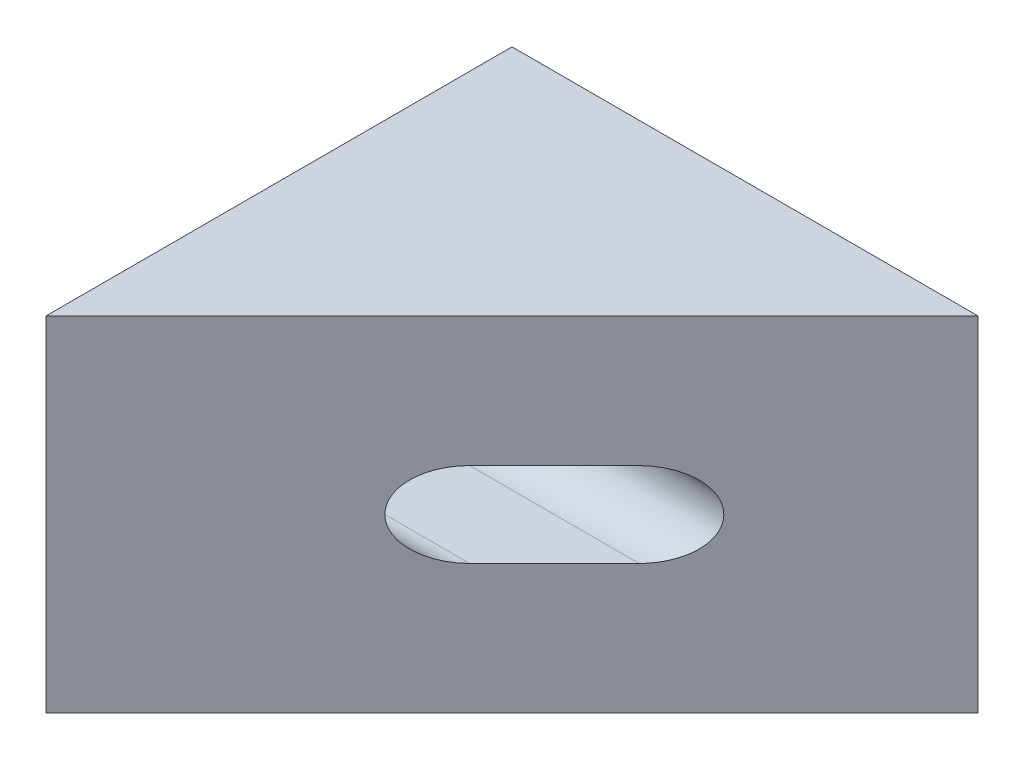
ISO-10303-21;
HEADER;
FILE_DESCRIPTION(('STEP AP214'),'2;1');
FILE_NAME('part.step','',(''),(''),'','','');
FILE_SCHEMA(('AUTOMOTIVE_DESIGN { 1 0 10303 214 1 1 1 1 }'));
ENDSEC;
DATA;
#1=APPLICATION_CONTEXT('core data for automotive mechanical design processes');
#2=APPLICATION_PROTOCOL_DEFINITION('international standard','automotive_design',2000,#1);
#3=PRODUCT_CONTEXT('',#1,'mechanical');
#4=PRODUCT('Part','Part','',(#3));
#5=PRODUCT_RELATED_PRODUCT_CATEGORY('part','',(#4));
#6=PRODUCT_DEFINITION_FORMATION('','',#4);
#7=PRODUCT_DEFINITION_CONTEXT('part definition',#1,'design');
#8=PRODUCT_DEFINITION('design','',#6,#7);
#9=PRODUCT_DEFINITION_SHAPE('','',#8);
#10=(LENGTH_UNIT() NAMED_UNIT(*) SI_UNIT(.MILLI.,.METRE.));
#11=(NAMED_UNIT(*) PLANE_ANGLE_UNIT() SI_UNIT($,.RADIAN.));
#12=(NAMED_UNIT(*) SI_UNIT($,.STERADIAN.) SOLID_ANGLE_UNIT());
#13=UNCERTAINTY_MEASURE_WITH_UNIT(LENGTH_MEASURE(1.E-05),#10,'distance_accuracy_value','');
#14=(GEOMETRIC_REPRESENTATION_CONTEXT(3) GLOBAL_UNCERTAINTY_ASSIGNED_CONTEXT((#13)) GLOBAL_UNIT_ASSIGNED_CONTEXT((#10,
#11,#12)) REPRESENTATION_CONTEXT('',''));
#15=CARTESIAN_POINT('',(0.,0.,0.));
#16=DIRECTION('',(0.,0.,1.));
#17=DIRECTION('',(1.,0.,0.));
#18=AXIS2_PLACEMENT_3D('',#15,#16,#17);
#19=CARTESIAN_POINT('',(27.5,10.15,0.));
#20=DIRECTION('',(0.,0.,1.));
#21=DIRECTION('',(1.,0.,0.));
#22=AXIS2_PLACEMENT_3D('',#19,#20,#21);
#23=PLANE('',#22);
#24=DIRECTION('',(-1.,0.,0.));
#25=VECTOR('',#24,1.);
#26=CARTESIAN_POINT('',(27.5,-10.15,0.));
#27=LINE('',#26,#25);
#28=CARTESIAN_POINT('',(27.5,-10.15,0.));
#29=VERTEX_POINT('',#28);
#30=CARTESIAN_POINT('',(0.,-10.15,0.));
#31=VERTEX_POINT('',#30);
#32=EDGE_CURVE('E118',#29,#31,#27,.T.);
#33=ORIENTED_EDGE('',*,*,#32,.T.);
#34=DIRECTION('',(0.,-1.,0.));
#35=VECTOR('',#34,1.);
#36=CARTESIAN_POINT('',(0.,10.15,0.));
#37=LINE('',#36,#35);
#38=CARTESIAN_POINT('',(0.,10.15,0.));
#39=VERTEX_POINT('',#38);
#40=EDGE_CURVE('E140',#39,#31,#37,.T.);
#41=ORIENTED_EDGE('',*,*,#40,.F.);
#42=DIRECTION('',(-1.,0.,0.));
#43=VECTOR('',#42,1.);
#44=CARTESIAN_POINT('',(27.5,10.15,0.));
#45=LINE('',#44,#43);
#46=CARTESIAN_POINT('',(27.5,10.15,0.));
#47=VERTEX_POINT('',#46);
#48=EDGE_CURVE('E121',#47,#39,#45,.T.);
#49=ORIENTED_EDGE('',*,*,#48,.F.);
#50=DIRECTION('',(0.,-1.,0.));
#51=VECTOR('',#50,1.);
#52=CARTESIAN_POINT('',(27.5,10.15,0.));
#53=LINE('',#52,#51);
#54=EDGE_CURVE('E129',#47,#29,#53,.T.);
#55=ORIENTED_EDGE('',*,*,#54,.T.);
#56=EDGE_LOOP('',(#33,#41,#49,#55));
#57=FACE_BOUND('',#56,.T.);
#58=ADVANCED_FACE('F34',(#57),#23,.F.);
#59=CARTESIAN_POINT('',(0.,10.15,0.));
#60=DIRECTION('',(1.,0.,0.));
#61=DIRECTION('',(0.,0.,-1.));
#62=AXIS2_PLACEMENT_3D('',#59,#60,#61);
#63=PLANE('',#62);
#64=DIRECTION('',(0.,0.,-1.));
#65=VECTOR('',#64,1.);
#66=CARTESIAN_POINT('',(0.,2.5,15.));
#67=LINE('',#66,#65);
#68=CARTESIAN_POINT('',(0.,2.5,15.));
#69=VERTEX_POINT('',#68);
#70=CARTESIAN_POINT('',(0.,2.5,10.));
#71=VERTEX_POINT('',#70);
#72=EDGE_CURVE('E104',#69,#71,#67,.T.);
#73=ORIENTED_EDGE('',*,*,#72,.F.);
#74=CARTESIAN_POINT('',(0.,0.,15.));
#75=DIRECTION('',(-1.,0.,0.));
#76=DIRECTION('',(0.,0.,1.));
#77=AXIS2_PLACEMENT_3D('',#74,#75,#76);
#78=CIRCLE('',#77,2.5);
#79=CARTESIAN_POINT('',(0.,-2.5,15.));
#80=VERTEX_POINT('',#79);
#81=EDGE_CURVE('E48',#80,#69,#78,.T.);
#82=ORIENTED_EDGE('',*,*,#81,.F.);
#83=DIRECTION('',(0.,0.,1.));
#84=VECTOR('',#83,1.);
#85=CARTESIAN_POINT('',(0.,-2.5,15.));
#86=LINE('',#85,#84);
#87=CARTESIAN_POINT('',(0.,-2.5,10.));
#88=VERTEX_POINT('',#87);
#89=EDGE_CURVE('E111',#88,#80,#86,.T.);
#90=ORIENTED_EDGE('',*,*,#89,.F.);
#91=CARTESIAN_POINT('',(0.,0.,10.));
#92=DIRECTION('',(-1.,0.,0.));
#93=DIRECTION('',(0.,0.,1.));
#94=AXIS2_PLACEMENT_3D('',#91,#92,#93);
#95=CIRCLE('',#94,2.5);
#96=EDGE_CURVE('E95',#71,#88,#95,.T.);
#97=ORIENTED_EDGE('',*,*,#96,.F.);
#98=EDGE_LOOP('',(#73,#82,#90,#97));
#99=FACE_BOUND('',#98,.T.);
#100=DIRECTION('',(0.,0.,1.));
#101=VECTOR('',#100,1.);
#102=CARTESIAN_POINT('',(0.,-10.15,0.));
#103=LINE('',#102,#101);
#104=CARTESIAN_POINT('',(0.,-10.15,27.5));
#105=VERTEX_POINT('',#104);
#106=EDGE_CURVE('E132',#31,#105,#103,.T.);
#107=ORIENTED_EDGE('',*,*,#106,.T.);
#108=DIRECTION('',(0.,-1.,0.));
#109=VECTOR('',#108,1.);
#110=CARTESIAN_POINT('',(0.,10.15,27.5));
#111=LINE('',#110,#109);
#112=CARTESIAN_POINT('',(0.,10.15,27.5));
#113=VERTEX_POINT('',#112);
#114=EDGE_CURVE('E137',#113,#105,#111,.T.);
#115=ORIENTED_EDGE('',*,*,#114,.F.);
#116=DIRECTION('',(0.,0.,1.));
#117=VECTOR('',#116,1.);
#118=CARTESIAN_POINT('',(0.,10.15,0.));
#119=LINE('',#118,#117);
#120=EDGE_CURVE('E124',#39,#113,#119,.T.);
#121=ORIENTED_EDGE('',*,*,#120,.F.);
#122=ORIENTED_EDGE('',*,*,#40,.T.);
#123=EDGE_LOOP('',(#107,#115,#121,#122));
#124=FACE_BOUND('',#123,.T.);
#125=ADVANCED_FACE('F108',(#99,#124),#63,.F.);
#126=CARTESIAN_POINT('',(0.,10.15,27.5));
#127=DIRECTION('',(-0.707106781186548,0.,-0.707106781186548));
#128=DIRECTION('',(-0.707106781186548,0.,0.707106781186548));
#129=AXIS2_PLACEMENT_3D('',#126,#127,#128);
#130=PLANE('',#129);
#131=DIRECTION('',(-0.707106781186548,0.,0.707106781186548));
#132=VECTOR('',#131,1.);
#133=CARTESIAN_POINT('',(0.,-2.5,27.5));
#134=LINE('',#133,#132);
#135=CARTESIAN_POINT('',(17.5,-2.5,10.));
#136=VERTEX_POINT('',#135);
#137=CARTESIAN_POINT('',(12.5,-2.5,15.));
#138=VERTEX_POINT('',#137);
#139=EDGE_CURVE('E41',#136,#138,#134,.T.);
#140=ORIENTED_EDGE('',*,*,#139,.T.);
#141=CARTESIAN_POINT('',(12.5,0.,15.));
#142=DIRECTION('',(-0.707106781186548,0.,-0.707106781186548));
#143=DIRECTION('',(-0.707106781186548,0.,0.707106781186548));
#144=AXIS2_PLACEMENT_3D('',#141,#142,#143);
#145=ELLIPSE('',#144,3.53553390593274,2.5);
#146=CARTESIAN_POINT('',(12.5,2.5,15.));
#147=VERTEX_POINT('',#146);
#148=EDGE_CURVE('E11',#138,#147,#145,.T.);
#149=ORIENTED_EDGE('',*,*,#148,.T.);
#150=DIRECTION('',(0.707106781186548,0.,-0.707106781186548));
#151=VECTOR('',#150,1.);
#152=CARTESIAN_POINT('',(0.,2.5,27.5));
#153=LINE('',#152,#151);
#154=CARTESIAN_POINT('',(17.5,2.5,10.));
#155=VERTEX_POINT('',#154);
#156=EDGE_CURVE('E143',#147,#155,#153,.T.);
#157=ORIENTED_EDGE('',*,*,#156,.T.);
#158=CARTESIAN_POINT('',(17.5,0.,10.));
#159=DIRECTION('',(-0.707106781186548,0.,-0.707106781186548));
#160=DIRECTION('',(-0.707106781186548,0.,0.707106781186548));
#161=AXIS2_PLACEMENT_3D('',#158,#159,#160);
#162=ELLIPSE('',#161,3.53553390593274,2.5);
#163=EDGE_CURVE('E98',#155,#136,#162,.T.);
#164=ORIENTED_EDGE('',*,*,#163,.T.);
#165=EDGE_LOOP('',(#140,#149,#157,#164));
#166=FACE_BOUND('',#165,.T.);
#167=DIRECTION('',(0.707106781186547,0.,-0.707106781186548));
#168=VECTOR('',#167,1.);
#169=CARTESIAN_POINT('',(0.,-10.15,27.5));
#170=LINE('',#169,#168);
#171=EDGE_CURVE('E125',#105,#29,#170,.T.);
#172=ORIENTED_EDGE('',*,*,#171,.T.);
#173=ORIENTED_EDGE('',*,*,#54,.F.);
#174=DIRECTION('',(0.707106781186547,0.,-0.707106781186548));
#175=VECTOR('',#174,1.);
#176=CARTESIAN_POINT('',(0.,10.15,27.5));
#177=LINE('',#176,#175);
#178=EDGE_CURVE('E127',#113,#47,#177,.T.);
#179=ORIENTED_EDGE('',*,*,#178,.F.);
#180=ORIENTED_EDGE('',*,*,#114,.T.);
#181=EDGE_LOOP('',(#172,#173,#179,#180));
#182=FACE_BOUND('',#181,.T.);
#183=ADVANCED_FACE('F147',(#166,#182),#130,.F.);
#184=CARTESIAN_POINT('',(0.,10.15,0.));
#185=DIRECTION('',(0.,1.,0.));
#186=DIRECTION('',(0.,0.,1.));
#187=AXIS2_PLACEMENT_3D('',#184,#185,#186);
#188=PLANE('',#187);
#189=ORIENTED_EDGE('',*,*,#48,.T.);
#190=ORIENTED_EDGE('',*,*,#120,.T.);
#191=ORIENTED_EDGE('',*,*,#178,.T.);
#192=EDGE_LOOP('',(#189,#190,#191));
#193=FACE_BOUND('',#192,.T.);
#194=ADVANCED_FACE('F161',(#193),#188,.T.);
#195=CARTESIAN_POINT('',(0.,-10.15,0.));
#196=DIRECTION('',(0.,1.,0.));
#197=DIRECTION('',(0.,0.,1.));
#198=AXIS2_PLACEMENT_3D('',#195,#196,#197);
#199=PLANE('',#198);
#200=ORIENTED_EDGE('',*,*,#32,.F.);
#201=ORIENTED_EDGE('',*,*,#171,.F.);
#202=ORIENTED_EDGE('',*,*,#106,.F.);
#203=EDGE_LOOP('',(#200,#201,#202));
#204=FACE_BOUND('',#203,.T.);
#205=ADVANCED_FACE('F154',(#204),#199,.F.);
#206=CARTESIAN_POINT('',(20.3,0.,15.));
#207=DIRECTION('',(-1.,0.,0.));
#208=DIRECTION('',(0.,0.,1.));
#209=AXIS2_PLACEMENT_3D('',#206,#207,#208);
#210=CYLINDRICAL_SURFACE('',#209,2.5);
#211=DIRECTION('',(-1.,0.,0.));
#212=VECTOR('',#211,1.);
#213=CARTESIAN_POINT('',(20.3,-2.5,15.));
#214=LINE('',#213,#212);
#215=EDGE_CURVE('E116',#138,#80,#214,.T.);
#216=ORIENTED_EDGE('',*,*,#215,.T.);
#217=ORIENTED_EDGE('',*,*,#81,.T.);
#218=DIRECTION('',(-1.,0.,0.));
#219=VECTOR('',#218,1.);
#220=CARTESIAN_POINT('',(20.3,2.5,15.));
#221=LINE('',#220,#219);
#222=EDGE_CURVE('E101',#147,#69,#221,.T.);
#223=ORIENTED_EDGE('',*,*,#222,.F.);
#224=ORIENTED_EDGE('',*,*,#148,.F.);
#225=EDGE_LOOP('',(#216,#217,#223,#224));
#226=FACE_BOUND('',#225,.T.);
#227=ADVANCED_FACE('F152',(#226),#210,.F.);
#228=CARTESIAN_POINT('',(20.3,-2.5,15.));
#229=DIRECTION('',(0.,-1.,0.));
#230=DIRECTION('',(0.,0.,-1.));
#231=AXIS2_PLACEMENT_3D('',#228,#229,#230);
#232=PLANE('',#231);
#233=DIRECTION('',(-1.,0.,0.));
#234=VECTOR('',#233,1.);
#235=CARTESIAN_POINT('',(20.3,-2.5,10.));
#236=LINE('',#235,#234);
#237=EDGE_CURVE('E100',#136,#88,#236,.T.);
#238=ORIENTED_EDGE('',*,*,#237,.T.);
#239=ORIENTED_EDGE('',*,*,#89,.T.);
#240=ORIENTED_EDGE('',*,*,#215,.F.);
#241=ORIENTED_EDGE('',*,*,#139,.F.);
#242=EDGE_LOOP('',(#238,#239,#240,#241));
#243=FACE_BOUND('',#242,.T.);
#244=ADVANCED_FACE('F151',(#243),#232,.F.);
#245=CARTESIAN_POINT('',(20.3,0.,10.));
#246=DIRECTION('',(-1.,0.,0.));
#247=DIRECTION('',(0.,0.,1.));
#248=AXIS2_PLACEMENT_3D('',#245,#246,#247);
#249=CYLINDRICAL_SURFACE('',#248,2.5);
#250=DIRECTION('',(-1.,0.,0.));
#251=VECTOR('',#250,1.);
#252=CARTESIAN_POINT('',(20.3,2.5,10.));
#253=LINE('',#252,#251);
#254=EDGE_CURVE('E56',#155,#71,#253,.T.);
#255=ORIENTED_EDGE('',*,*,#254,.T.);
#256=ORIENTED_EDGE('',*,*,#96,.T.);
#257=ORIENTED_EDGE('',*,*,#237,.F.);
#258=ORIENTED_EDGE('',*,*,#163,.F.);
#259=EDGE_LOOP('',(#255,#256,#257,#258));
#260=FACE_BOUND('',#259,.T.);
#261=ADVANCED_FACE('F92',(#260),#249,.F.);
#262=CARTESIAN_POINT('',(20.3,2.5,15.));
#263=DIRECTION('',(0.,1.,0.));
#264=DIRECTION('',(0.,0.,1.));
#265=AXIS2_PLACEMENT_3D('',#262,#263,#264);
#266=PLANE('',#265);
#267=ORIENTED_EDGE('',*,*,#222,.T.);
#268=ORIENTED_EDGE('',*,*,#72,.T.);
#269=ORIENTED_EDGE('',*,*,#254,.F.);
#270=ORIENTED_EDGE('',*,*,#156,.F.);
#271=EDGE_LOOP('',(#267,#268,#269,#270));
#272=FACE_BOUND('',#271,.T.);
#273=ADVANCED_FACE('F105',(#272),#266,.F.);
#274=CLOSED_SHELL('',(#58,#125,#183,#194,#205,#227,#244,#261,#273));
#275=MANIFOLD_SOLID_BREP('B2',#274);
#276=ADVANCED_BREP_SHAPE_REPRESENTATION('',(#18,#275),#14);
#277=SHAPE_DEFINITION_REPRESENTATION(#9,#276);
ENDSEC;
END-ISO-10303-21;
